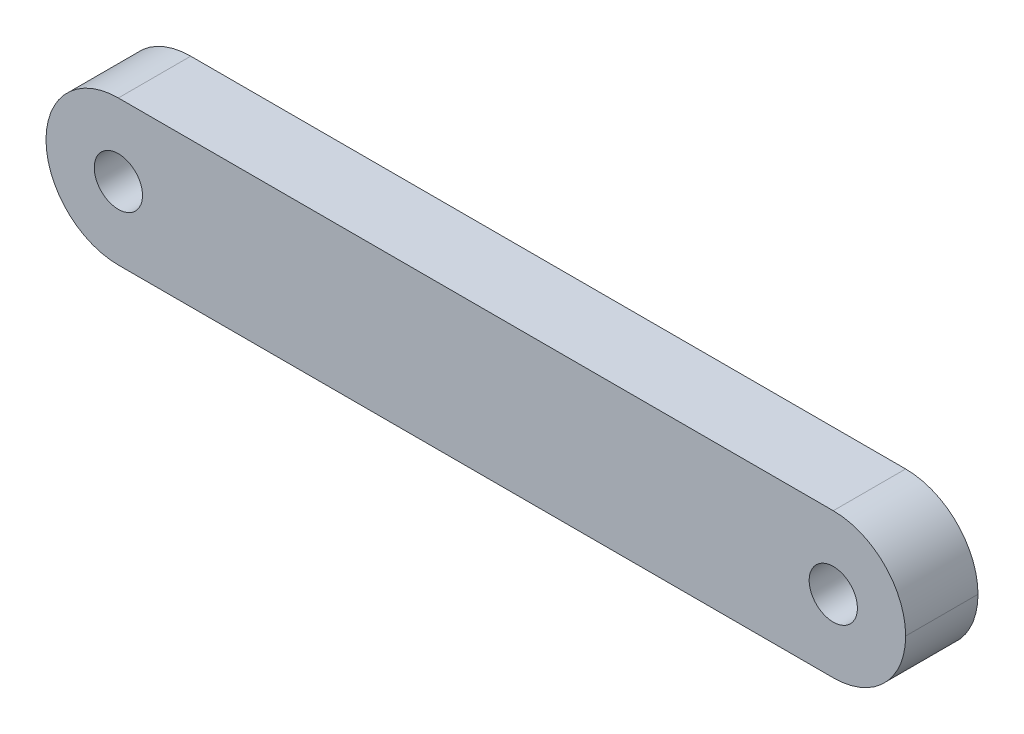
ISO-10303-21;
HEADER;
FILE_DESCRIPTION(('STEP AP214'),'2;1');
FILE_NAME('part.step','',(''),(''),'','','');
FILE_SCHEMA(('AUTOMOTIVE_DESIGN { 1 0 10303 214 1 1 1 1 }'));
ENDSEC;
DATA;
#1=APPLICATION_CONTEXT('core data for automotive mechanical design processes');
#2=APPLICATION_PROTOCOL_DEFINITION('international standard','automotive_design',2000,#1);
#3=PRODUCT_CONTEXT('',#1,'mechanical');
#4=PRODUCT('Part','Part','',(#3));
#5=PRODUCT_RELATED_PRODUCT_CATEGORY('part','',(#4));
#6=PRODUCT_DEFINITION_FORMATION('','',#4);
#7=PRODUCT_DEFINITION_CONTEXT('part definition',#1,'design');
#8=PRODUCT_DEFINITION('design','',#6,#7);
#9=PRODUCT_DEFINITION_SHAPE('','',#8);
#10=(LENGTH_UNIT() NAMED_UNIT(*) SI_UNIT(.MILLI.,.METRE.));
#11=(NAMED_UNIT(*) PLANE_ANGLE_UNIT() SI_UNIT($,.RADIAN.));
#12=(NAMED_UNIT(*) SI_UNIT($,.STERADIAN.) SOLID_ANGLE_UNIT());
#13=UNCERTAINTY_MEASURE_WITH_UNIT(LENGTH_MEASURE(1.E-05),#10,'distance_accuracy_value','');
#14=(GEOMETRIC_REPRESENTATION_CONTEXT(3) GLOBAL_UNCERTAINTY_ASSIGNED_CONTEXT((#13)) GLOBAL_UNIT_ASSIGNED_CONTEXT((#10,
#11,#12)) REPRESENTATION_CONTEXT('',''));
#15=CARTESIAN_POINT('',(0.,0.,0.));
#16=DIRECTION('',(0.,0.,1.));
#17=DIRECTION('',(1.,0.,0.));
#18=AXIS2_PLACEMENT_3D('',#15,#16,#17);
#19=CARTESIAN_POINT('',(0.,0.,3.));
#20=DIRECTION('',(0.,0.,-1.));
#21=DIRECTION('',(-1.,0.,0.));
#22=AXIS2_PLACEMENT_3D('',#19,#20,#21);
#23=PLANE('',#22);
#24=DIRECTION('',(1.,0.,0.));
#25=VECTOR('',#24,1.);
#26=CARTESIAN_POINT('',(0.,0.,3.));
#27=LINE('',#26,#25);
#28=CARTESIAN_POINT('',(3.,0.,3.));
#29=VERTEX_POINT('',#28);
#30=CARTESIAN_POINT('',(32.64,0.,3.));
#31=VERTEX_POINT('',#30);
#32=EDGE_CURVE('E135',#29,#31,#27,.T.);
#33=ORIENTED_EDGE('',*,*,#32,.T.);
#34=CARTESIAN_POINT('',(32.64,3.,3.));
#35=DIRECTION('',(0.,0.,-1.));
#36=DIRECTION('',(-1.,0.,0.));
#37=AXIS2_PLACEMENT_3D('',#34,#35,#36);
#38=CIRCLE('',#37,3.);
#39=CARTESIAN_POINT('',(35.64,3.,3.));
#40=VERTEX_POINT('',#39);
#41=EDGE_CURVE('E119',#31,#40,#38,.F.);
#42=ORIENTED_EDGE('',*,*,#41,.T.);
#43=CARTESIAN_POINT('',(32.64,3.,3.));
#44=DIRECTION('',(0.,0.,-1.));
#45=DIRECTION('',(-1.,0.,0.));
#46=AXIS2_PLACEMENT_3D('',#43,#44,#45);
#47=CIRCLE('',#46,3.);
#48=CARTESIAN_POINT('',(32.64,6.,3.));
#49=VERTEX_POINT('',#48);
#50=EDGE_CURVE('E56',#40,#49,#47,.F.);
#51=ORIENTED_EDGE('',*,*,#50,.T.);
#52=DIRECTION('',(-1.,0.,0.));
#53=VECTOR('',#52,1.);
#54=CARTESIAN_POINT('',(0.,6.,3.));
#55=LINE('',#54,#53);
#56=CARTESIAN_POINT('',(3.,6.,3.));
#57=VERTEX_POINT('',#56);
#58=EDGE_CURVE('E104',#49,#57,#55,.T.);
#59=ORIENTED_EDGE('',*,*,#58,.T.);
#60=CARTESIAN_POINT('',(3.,3.,3.));
#61=DIRECTION('',(0.,0.,-1.));
#62=DIRECTION('',(-1.,0.,0.));
#63=AXIS2_PLACEMENT_3D('',#60,#61,#62);
#64=CIRCLE('',#63,3.);
#65=CARTESIAN_POINT('',(0.,3.,3.));
#66=VERTEX_POINT('',#65);
#67=EDGE_CURVE('E123',#57,#66,#64,.F.);
#68=ORIENTED_EDGE('',*,*,#67,.T.);
#69=CARTESIAN_POINT('',(3.,3.,3.));
#70=DIRECTION('',(0.,0.,-1.));
#71=DIRECTION('',(-1.,0.,0.));
#72=AXIS2_PLACEMENT_3D('',#69,#70,#71);
#73=CIRCLE('',#72,3.);
#74=EDGE_CURVE('E107',#66,#29,#73,.F.);
#75=ORIENTED_EDGE('',*,*,#74,.T.);
#76=EDGE_LOOP('',(#33,#42,#51,#59,#68,#75));
#77=FACE_BOUND('',#76,.T.);
#78=CARTESIAN_POINT('',(3.,3.,3.));
#79=DIRECTION('',(0.,0.,1.));
#80=DIRECTION('',(1.,0.,0.));
#81=AXIS2_PLACEMENT_3D('',#78,#79,#80);
#82=CIRCLE('',#81,1.);
#83=CARTESIAN_POINT('',(4.,3.,3.));
#84=VERTEX_POINT('',#83);
#85=EDGE_CURVE('E137',#84,#84,#82,.T.);
#86=ORIENTED_EDGE('',*,*,#85,.F.);
#87=EDGE_LOOP('',(#86));
#88=FACE_BOUND('',#87,.T.);
#89=CARTESIAN_POINT('',(32.64,3.,3.));
#90=DIRECTION('',(0.,0.,1.));
#91=DIRECTION('',(1.,0.,0.));
#92=AXIS2_PLACEMENT_3D('',#89,#90,#91);
#93=CIRCLE('',#92,0.999999999999998);
#94=CARTESIAN_POINT('',(33.64,3.,3.));
#95=VERTEX_POINT('',#94);
#96=EDGE_CURVE('E115',#95,#95,#93,.T.);
#97=ORIENTED_EDGE('',*,*,#96,.F.);
#98=EDGE_LOOP('',(#97));
#99=FACE_BOUND('',#98,.T.);
#100=ADVANCED_FACE('F33',(#77,#88,#99),#23,.F.);
#101=CARTESIAN_POINT('',(0.,0.,0.));
#102=DIRECTION('',(0.,0.,-1.));
#103=DIRECTION('',(-1.,0.,0.));
#104=AXIS2_PLACEMENT_3D('',#101,#102,#103);
#105=PLANE('',#104);
#106=CARTESIAN_POINT('',(3.,3.,0.));
#107=DIRECTION('',(0.,0.,1.));
#108=DIRECTION('',(1.,0.,0.));
#109=AXIS2_PLACEMENT_3D('',#106,#107,#108);
#110=CIRCLE('',#109,1.);
#111=CARTESIAN_POINT('',(4.,3.,0.));
#112=VERTEX_POINT('',#111);
#113=EDGE_CURVE('E141',#112,#112,#110,.T.);
#114=ORIENTED_EDGE('',*,*,#113,.T.);
#115=EDGE_LOOP('',(#114));
#116=FACE_BOUND('',#115,.T.);
#117=CARTESIAN_POINT('',(32.64,3.,0.));
#118=DIRECTION('',(0.,0.,-1.));
#119=DIRECTION('',(-1.,0.,0.));
#120=AXIS2_PLACEMENT_3D('',#117,#118,#119);
#121=CIRCLE('',#120,3.);
#122=CARTESIAN_POINT('',(32.64,6.,0.));
#123=VERTEX_POINT('',#122);
#124=CARTESIAN_POINT('',(35.64,3.,0.));
#125=VERTEX_POINT('',#124);
#126=EDGE_CURVE('E98',#123,#125,#121,.T.);
#127=ORIENTED_EDGE('',*,*,#126,.T.);
#128=CARTESIAN_POINT('',(32.64,3.,0.));
#129=DIRECTION('',(0.,0.,-1.));
#130=DIRECTION('',(-1.,0.,0.));
#131=AXIS2_PLACEMENT_3D('',#128,#129,#130);
#132=CIRCLE('',#131,3.);
#133=CARTESIAN_POINT('',(32.64,0.,0.));
#134=VERTEX_POINT('',#133);
#135=EDGE_CURVE('E130',#125,#134,#132,.T.);
#136=ORIENTED_EDGE('',*,*,#135,.T.);
#137=DIRECTION('',(1.,0.,0.));
#138=VECTOR('',#137,1.);
#139=CARTESIAN_POINT('',(0.,0.,0.));
#140=LINE('',#139,#138);
#141=CARTESIAN_POINT('',(3.,0.,0.));
#142=VERTEX_POINT('',#141);
#143=EDGE_CURVE('E93',#142,#134,#140,.T.);
#144=ORIENTED_EDGE('',*,*,#143,.F.);
#145=CARTESIAN_POINT('',(3.,3.,0.));
#146=DIRECTION('',(0.,0.,-1.));
#147=DIRECTION('',(-1.,0.,0.));
#148=AXIS2_PLACEMENT_3D('',#145,#146,#147);
#149=CIRCLE('',#148,3.);
#150=CARTESIAN_POINT('',(0.,3.,0.));
#151=VERTEX_POINT('',#150);
#152=EDGE_CURVE('E86',#142,#151,#149,.T.);
#153=ORIENTED_EDGE('',*,*,#152,.T.);
#154=CARTESIAN_POINT('',(3.,3.,0.));
#155=DIRECTION('',(0.,0.,-1.));
#156=DIRECTION('',(-1.,0.,0.));
#157=AXIS2_PLACEMENT_3D('',#154,#155,#156);
#158=CIRCLE('',#157,3.);
#159=CARTESIAN_POINT('',(3.,6.,0.));
#160=VERTEX_POINT('',#159);
#161=EDGE_CURVE('E91',#151,#160,#158,.T.);
#162=ORIENTED_EDGE('',*,*,#161,.T.);
#163=DIRECTION('',(-1.,0.,0.));
#164=VECTOR('',#163,1.);
#165=CARTESIAN_POINT('',(0.,6.,0.));
#166=LINE('',#165,#164);
#167=EDGE_CURVE('E133',#123,#160,#166,.T.);
#168=ORIENTED_EDGE('',*,*,#167,.F.);
#169=EDGE_LOOP('',(#127,#136,#144,#153,#162,#168));
#170=FACE_BOUND('',#169,.T.);
#171=CARTESIAN_POINT('',(32.64,3.,0.));
#172=DIRECTION('',(0.,0.,1.));
#173=DIRECTION('',(1.,0.,0.));
#174=AXIS2_PLACEMENT_3D('',#171,#172,#173);
#175=CIRCLE('',#174,0.999999999999998);
#176=CARTESIAN_POINT('',(33.64,3.,0.));
#177=VERTEX_POINT('',#176);
#178=EDGE_CURVE('E110',#177,#177,#175,.T.);
#179=ORIENTED_EDGE('',*,*,#178,.T.);
#180=EDGE_LOOP('',(#179));
#181=FACE_BOUND('',#180,.T.);
#182=ADVANCED_FACE('F88',(#116,#170,#181),#105,.T.);
#183=CARTESIAN_POINT('',(0.,0.,3.));
#184=DIRECTION('',(0.,1.,0.));
#185=DIRECTION('',(0.,0.,1.));
#186=AXIS2_PLACEMENT_3D('',#183,#184,#185);
#187=PLANE('',#186);
#188=ORIENTED_EDGE('',*,*,#143,.T.);
#189=DIRECTION('',(0.,0.,-1.));
#190=VECTOR('',#189,1.);
#191=CARTESIAN_POINT('',(32.64,0.,3.));
#192=LINE('',#191,#190);
#193=EDGE_CURVE('E125',#134,#31,#192,.F.);
#194=ORIENTED_EDGE('',*,*,#193,.T.);
#195=ORIENTED_EDGE('',*,*,#32,.F.);
#196=DIRECTION('',(0.,0.,-1.));
#197=VECTOR('',#196,1.);
#198=CARTESIAN_POINT('',(3.,0.,3.));
#199=LINE('',#198,#197);
#200=EDGE_CURVE('E128',#29,#142,#199,.T.);
#201=ORIENTED_EDGE('',*,*,#200,.T.);
#202=EDGE_LOOP('',(#188,#194,#195,#201));
#203=FACE_BOUND('',#202,.T.);
#204=ADVANCED_FACE('F157',(#203),#187,.F.);
#205=CARTESIAN_POINT('',(0.,6.,3.));
#206=DIRECTION('',(0.,-1.,0.));
#207=DIRECTION('',(0.,0.,-1.));
#208=AXIS2_PLACEMENT_3D('',#205,#206,#207);
#209=PLANE('',#208);
#210=ORIENTED_EDGE('',*,*,#58,.F.);
#211=DIRECTION('',(0.,0.,-1.));
#212=VECTOR('',#211,1.);
#213=CARTESIAN_POINT('',(32.64,6.,3.));
#214=LINE('',#213,#212);
#215=EDGE_CURVE('E11',#49,#123,#214,.T.);
#216=ORIENTED_EDGE('',*,*,#215,.T.);
#217=ORIENTED_EDGE('',*,*,#167,.T.);
#218=DIRECTION('',(0.,0.,-1.));
#219=VECTOR('',#218,1.);
#220=CARTESIAN_POINT('',(3.,6.,3.));
#221=LINE('',#220,#219);
#222=EDGE_CURVE('E42',#160,#57,#221,.F.);
#223=ORIENTED_EDGE('',*,*,#222,.T.);
#224=EDGE_LOOP('',(#210,#216,#217,#223));
#225=FACE_BOUND('',#224,.T.);
#226=ADVANCED_FACE('F165',(#225),#209,.F.);
#227=CARTESIAN_POINT('',(3.,3.,3.));
#228=DIRECTION('',(0.,0.,-1.));
#229=DIRECTION('',(-1.,0.,0.));
#230=AXIS2_PLACEMENT_3D('',#227,#228,#229);
#231=CYLINDRICAL_SURFACE('',#230,1.);
#232=ORIENTED_EDGE('',*,*,#85,.T.);
#233=EDGE_LOOP('',(#232));
#234=FACE_BOUND('',#233,.T.);
#235=ORIENTED_EDGE('',*,*,#113,.F.);
#236=EDGE_LOOP('',(#235));
#237=FACE_BOUND('',#236,.T.);
#238=ADVANCED_FACE('F162',(#234,#237),#231,.F.);
#239=CARTESIAN_POINT('',(32.64,3.,3.));
#240=DIRECTION('',(0.,0.,-1.));
#241=DIRECTION('',(-1.,0.,0.));
#242=AXIS2_PLACEMENT_3D('',#239,#240,#241);
#243=CYLINDRICAL_SURFACE('',#242,0.999999999999998);
#244=ORIENTED_EDGE('',*,*,#96,.T.);
#245=EDGE_LOOP('',(#244));
#246=FACE_BOUND('',#245,.T.);
#247=ORIENTED_EDGE('',*,*,#178,.F.);
#248=EDGE_LOOP('',(#247));
#249=FACE_BOUND('',#248,.T.);
#250=ADVANCED_FACE('F149',(#246,#249),#243,.F.);
#251=CARTESIAN_POINT('',(32.64,3.,3.));
#252=DIRECTION('',(0.,0.,-1.));
#253=DIRECTION('',(-1.,0.,0.));
#254=AXIS2_PLACEMENT_3D('',#251,#252,#253);
#255=CYLINDRICAL_SURFACE('',#254,3.);
#256=ORIENTED_EDGE('',*,*,#215,.F.);
#257=ORIENTED_EDGE('',*,*,#50,.F.);
#258=DIRECTION('',(0.,0.,-1.));
#259=VECTOR('',#258,1.);
#260=CARTESIAN_POINT('',(35.64,3.,3.));
#261=LINE('',#260,#259);
#262=EDGE_CURVE('E108',#125,#40,#261,.F.);
#263=ORIENTED_EDGE('',*,*,#262,.F.);
#264=ORIENTED_EDGE('',*,*,#126,.F.);
#265=EDGE_LOOP('',(#256,#257,#263,#264));
#266=FACE_BOUND('',#265,.T.);
#267=ADVANCED_FACE('F174',(#266),#255,.T.);
#268=CARTESIAN_POINT('',(32.64,3.,3.));
#269=DIRECTION('',(0.,0.,-1.));
#270=DIRECTION('',(-1.,0.,0.));
#271=AXIS2_PLACEMENT_3D('',#268,#269,#270);
#272=CYLINDRICAL_SURFACE('',#271,3.);
#273=ORIENTED_EDGE('',*,*,#41,.F.);
#274=ORIENTED_EDGE('',*,*,#193,.F.);
#275=ORIENTED_EDGE('',*,*,#135,.F.);
#276=ORIENTED_EDGE('',*,*,#262,.T.);
#277=EDGE_LOOP('',(#273,#274,#275,#276));
#278=FACE_BOUND('',#277,.T.);
#279=ADVANCED_FACE('F171',(#278),#272,.T.);
#280=CARTESIAN_POINT('',(3.,3.,3.));
#281=DIRECTION('',(0.,0.,-1.));
#282=DIRECTION('',(-1.,0.,0.));
#283=AXIS2_PLACEMENT_3D('',#280,#281,#282);
#284=CYLINDRICAL_SURFACE('',#283,3.);
#285=DIRECTION('',(0.,0.,-1.));
#286=VECTOR('',#285,1.);
#287=CARTESIAN_POINT('',(0.,3.,3.));
#288=LINE('',#287,#286);
#289=EDGE_CURVE('E37',#66,#151,#288,.T.);
#290=ORIENTED_EDGE('',*,*,#289,.F.);
#291=ORIENTED_EDGE('',*,*,#67,.F.);
#292=ORIENTED_EDGE('',*,*,#222,.F.);
#293=ORIENTED_EDGE('',*,*,#161,.F.);
#294=EDGE_LOOP('',(#290,#291,#292,#293));
#295=FACE_BOUND('',#294,.T.);
#296=ADVANCED_FACE('F35',(#295),#284,.T.);
#297=CARTESIAN_POINT('',(3.,3.,3.));
#298=DIRECTION('',(0.,0.,-1.));
#299=DIRECTION('',(-1.,0.,0.));
#300=AXIS2_PLACEMENT_3D('',#297,#298,#299);
#301=CYLINDRICAL_SURFACE('',#300,3.);
#302=ORIENTED_EDGE('',*,*,#74,.F.);
#303=ORIENTED_EDGE('',*,*,#289,.T.);
#304=ORIENTED_EDGE('',*,*,#152,.F.);
#305=ORIENTED_EDGE('',*,*,#200,.F.);
#306=EDGE_LOOP('',(#302,#303,#304,#305));
#307=FACE_BOUND('',#306,.T.);
#308=ADVANCED_FACE('F106',(#307),#301,.T.);
#309=CLOSED_SHELL('',(#100,#182,#204,#226,#238,#250,#267,#279,#296,#308));
#310=MANIFOLD_SOLID_BREP('B2',#309);
#311=ADVANCED_BREP_SHAPE_REPRESENTATION('',(#18,#310),#14);
#312=SHAPE_DEFINITION_REPRESENTATION(#9,#311);
ENDSEC;
END-ISO-10303-21;
